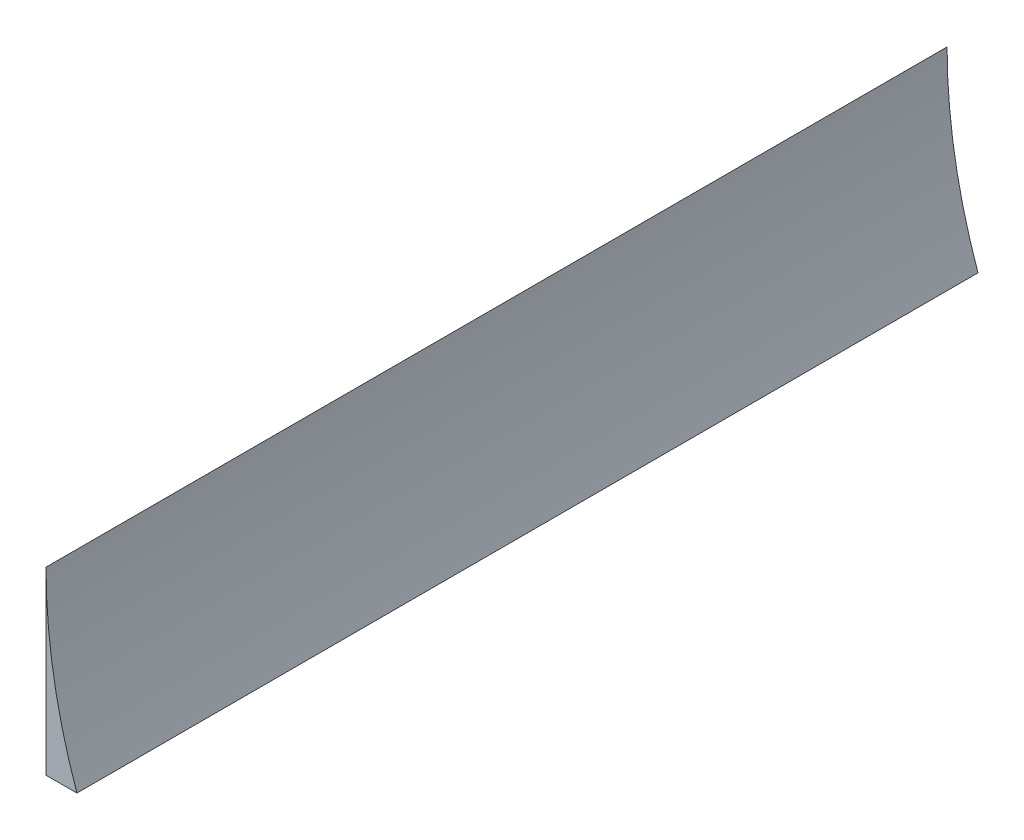
ISO-10303-21;
HEADER;
FILE_DESCRIPTION(('STEP AP214'),'2;1');
FILE_NAME('part.step','',(''),(''),'','','');
FILE_SCHEMA(('AUTOMOTIVE_DESIGN { 1 0 10303 214 1 1 1 1 }'));
ENDSEC;
DATA;
#1=APPLICATION_CONTEXT('core data for automotive mechanical design processes');
#2=APPLICATION_PROTOCOL_DEFINITION('international standard','automotive_design',2000,#1);
#3=PRODUCT_CONTEXT('',#1,'mechanical');
#4=PRODUCT('Part','Part','',(#3));
#5=PRODUCT_RELATED_PRODUCT_CATEGORY('part','',(#4));
#6=PRODUCT_DEFINITION_FORMATION('','',#4);
#7=PRODUCT_DEFINITION_CONTEXT('part definition',#1,'design');
#8=PRODUCT_DEFINITION('design','',#6,#7);
#9=PRODUCT_DEFINITION_SHAPE('','',#8);
#10=(LENGTH_UNIT() NAMED_UNIT(*) SI_UNIT(.MILLI.,.METRE.));
#11=(NAMED_UNIT(*) PLANE_ANGLE_UNIT() SI_UNIT($,.RADIAN.));
#12=(NAMED_UNIT(*) SI_UNIT($,.STERADIAN.) SOLID_ANGLE_UNIT());
#13=UNCERTAINTY_MEASURE_WITH_UNIT(LENGTH_MEASURE(1.E-05),#10,'distance_accuracy_value','');
#14=(GEOMETRIC_REPRESENTATION_CONTEXT(3) GLOBAL_UNCERTAINTY_ASSIGNED_CONTEXT((#13)) GLOBAL_UNIT_ASSIGNED_CONTEXT((#10,
#11,#12)) REPRESENTATION_CONTEXT('',''));
#15=CARTESIAN_POINT('',(0.,0.,0.));
#16=DIRECTION('',(0.,0.,1.));
#17=DIRECTION('',(1.,0.,0.));
#18=AXIS2_PLACEMENT_3D('',#15,#16,#17);
#19=CARTESIAN_POINT('',(-31.75,25.4,-15.875));
#20=DIRECTION('',(0.,0.,-1.));
#21=DIRECTION('',(0.,1.,0.));
#22=AXIS2_PLACEMENT_3D('',#19,#20,#21);
#23=PLANE('',#22);
#24=DIRECTION('',(0.,-1.,0.));
#25=VECTOR('',#24,1.);
#26=CARTESIAN_POINT('',(-20.0025,25.4,-15.875));
#27=LINE('',#26,#25);
#28=CARTESIAN_POINT('',(-20.0025,31.75,-15.875));
#29=VERTEX_POINT('',#28);
#30=CARTESIAN_POINT('',(-20.0025,25.4,-15.875));
#31=VERTEX_POINT('',#30);
#32=EDGE_CURVE('E70',#29,#31,#27,.T.);
#33=ORIENTED_EDGE('',*,*,#32,.F.);
#34=CARTESIAN_POINT('',(-0.9525,31.75,-15.875));
#35=DIRECTION('',(0.,0.,-1.));
#36=DIRECTION('',(-1.,0.,0.));
#37=AXIS2_PLACEMENT_3D('',#34,#35,#36);
#38=CIRCLE('',#37,19.05);
#39=CARTESIAN_POINT('',(-18.9130122421383,25.4,-15.875));
#40=VERTEX_POINT('',#39);
#41=EDGE_CURVE('E105',#40,#29,#38,.T.);
#42=ORIENTED_EDGE('',*,*,#41,.F.);
#43=DIRECTION('',(-1.,0.,0.));
#44=VECTOR('',#43,1.);
#45=CARTESIAN_POINT('',(-31.75,25.4,-15.875));
#46=LINE('',#45,#44);
#47=EDGE_CURVE('E101',#31,#40,#46,.F.);
#48=ORIENTED_EDGE('',*,*,#47,.F.);
#49=EDGE_LOOP('',(#33,#42,#48));
#50=FACE_BOUND('',#49,.T.);
#51=ADVANCED_FACE('F53',(#50),#23,.T.);
#52=CARTESIAN_POINT('',(-31.75,25.4,15.875));
#53=DIRECTION('',(0.,0.,-1.));
#54=DIRECTION('',(0.,1.,0.));
#55=AXIS2_PLACEMENT_3D('',#52,#53,#54);
#56=PLANE('',#55);
#57=CARTESIAN_POINT('',(-0.9525,31.75,15.875));
#58=DIRECTION('',(0.,0.,-1.));
#59=DIRECTION('',(-1.,0.,0.));
#60=AXIS2_PLACEMENT_3D('',#57,#58,#59);
#61=CIRCLE('',#60,19.05);
#62=CARTESIAN_POINT('',(-18.9130122421383,25.4,15.875));
#63=VERTEX_POINT('',#62);
#64=CARTESIAN_POINT('',(-20.0025,31.75,15.875));
#65=VERTEX_POINT('',#64);
#66=EDGE_CURVE('E93',#63,#65,#61,.T.);
#67=ORIENTED_EDGE('',*,*,#66,.T.);
#68=DIRECTION('',(0.,-1.,0.));
#69=VECTOR('',#68,1.);
#70=CARTESIAN_POINT('',(-20.0025,25.4,15.875));
#71=LINE('',#70,#69);
#72=CARTESIAN_POINT('',(-20.0025,25.4,15.875));
#73=VERTEX_POINT('',#72);
#74=EDGE_CURVE('E88',#65,#73,#71,.T.);
#75=ORIENTED_EDGE('',*,*,#74,.T.);
#76=DIRECTION('',(1.,0.,0.));
#77=VECTOR('',#76,1.);
#78=CARTESIAN_POINT('',(-31.75,25.4,15.875));
#79=LINE('',#78,#77);
#80=EDGE_CURVE('E63',#73,#63,#79,.T.);
#81=ORIENTED_EDGE('',*,*,#80,.T.);
#82=EDGE_LOOP('',(#67,#75,#81));
#83=FACE_BOUND('',#82,.T.);
#84=ADVANCED_FACE('F91',(#83),#56,.F.);
#85=CARTESIAN_POINT('',(-0.9525,31.75,103.07574));
#86=DIRECTION('',(0.,0.,-1.));
#87=DIRECTION('',(0.,-1.,0.));
#88=AXIS2_PLACEMENT_3D('',#85,#86,#87);
#89=CYLINDRICAL_SURFACE('',#88,19.05);
#90=ORIENTED_EDGE('',*,*,#66,.F.);
#91=DIRECTION('',(0.,0.,-1.));
#92=VECTOR('',#91,1.);
#93=CARTESIAN_POINT('',(-18.9130122421383,25.4,103.07574));
#94=LINE('',#93,#92);
#95=EDGE_CURVE('E99',#63,#40,#94,.T.);
#96=ORIENTED_EDGE('',*,*,#95,.T.);
#97=ORIENTED_EDGE('',*,*,#41,.T.);
#98=DIRECTION('',(0.,0.,1.));
#99=VECTOR('',#98,1.);
#100=CARTESIAN_POINT('',(-20.0025,31.75,-31.75));
#101=LINE('',#100,#99);
#102=EDGE_CURVE('E114',#65,#29,#101,.F.);
#103=ORIENTED_EDGE('',*,*,#102,.F.);
#104=EDGE_LOOP('',(#90,#96,#97,#103));
#105=FACE_BOUND('',#104,.T.);
#106=ADVANCED_FACE('F55',(#105),#89,.F.);
#107=CARTESIAN_POINT('',(0.,25.4,0.));
#108=DIRECTION('',(0.,1.,0.));
#109=DIRECTION('',(0.,0.,1.));
#110=AXIS2_PLACEMENT_3D('',#107,#108,#109);
#111=PLANE('',#110);
#112=ORIENTED_EDGE('',*,*,#80,.F.);
#113=DIRECTION('',(0.,0.,-1.));
#114=VECTOR('',#113,1.);
#115=CARTESIAN_POINT('',(-20.0025,25.4,0.));
#116=LINE('',#115,#114);
#117=EDGE_CURVE('E13',#73,#31,#116,.T.);
#118=ORIENTED_EDGE('',*,*,#117,.T.);
#119=ORIENTED_EDGE('',*,*,#47,.T.);
#120=ORIENTED_EDGE('',*,*,#95,.F.);
#121=EDGE_LOOP('',(#112,#118,#119,#120));
#122=FACE_BOUND('',#121,.T.);
#123=ADVANCED_FACE('F97',(#122),#111,.F.);
#124=CARTESIAN_POINT('',(-20.0025,0.,0.));
#125=DIRECTION('',(1.,0.,0.));
#126=DIRECTION('',(0.,0.,-1.));
#127=AXIS2_PLACEMENT_3D('',#124,#125,#126);
#128=PLANE('',#127);
#129=ORIENTED_EDGE('',*,*,#32,.T.);
#130=ORIENTED_EDGE('',*,*,#117,.F.);
#131=ORIENTED_EDGE('',*,*,#74,.F.);
#132=ORIENTED_EDGE('',*,*,#102,.T.);
#133=EDGE_LOOP('',(#129,#130,#131,#132));
#134=FACE_BOUND('',#133,.T.);
#135=ADVANCED_FACE('F87',(#134),#128,.F.);
#136=CLOSED_SHELL('',(#51,#84,#106,#123,#135));
#137=MANIFOLD_SOLID_BREP('B2',#136);
#138=ADVANCED_BREP_SHAPE_REPRESENTATION('',(#18,#137),#14);
#139=SHAPE_DEFINITION_REPRESENTATION(#9,#138);
ENDSEC;
END-ISO-10303-21;
